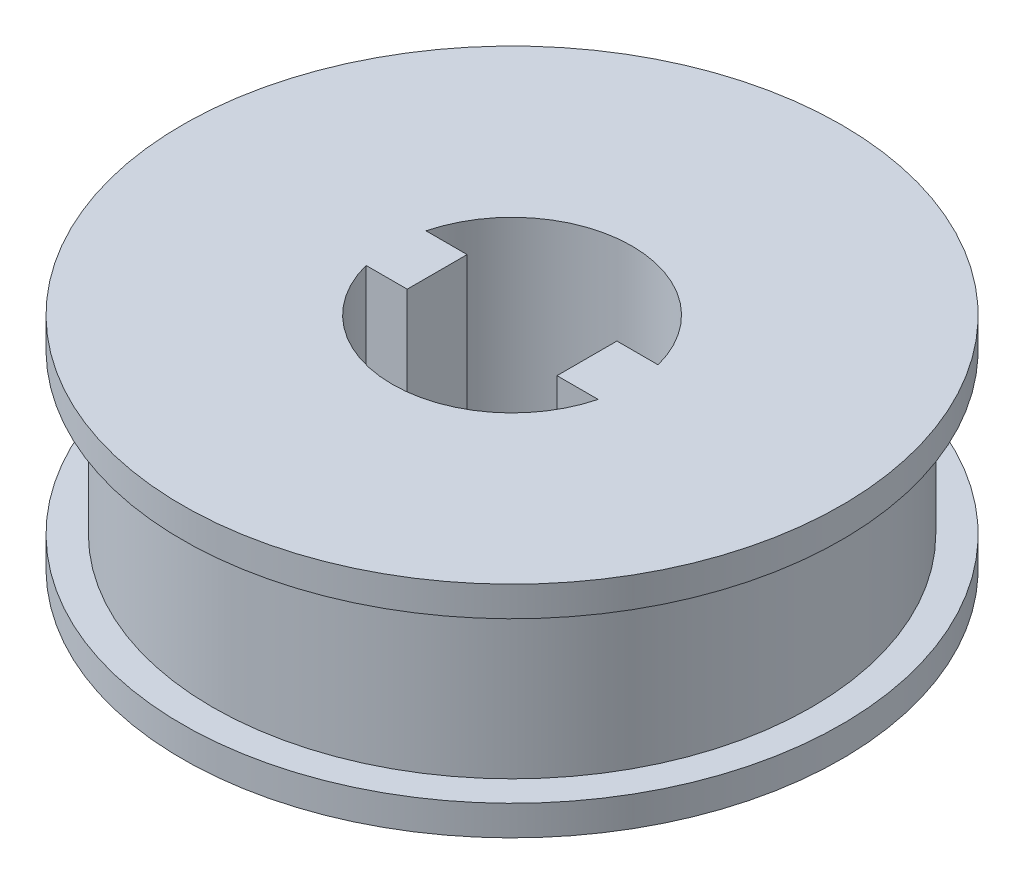
ISO-10303-21;
HEADER;
FILE_DESCRIPTION(('STEP AP214'),'2;1');
FILE_NAME('part.step','',(''),(''),'','','');
FILE_SCHEMA(('AUTOMOTIVE_DESIGN { 1 0 10303 214 1 1 1 1 }'));
ENDSEC;
DATA;
#1=APPLICATION_CONTEXT('core data for automotive mechanical design processes');
#2=APPLICATION_PROTOCOL_DEFINITION('international standard','automotive_design',2000,#1);
#3=PRODUCT_CONTEXT('',#1,'mechanical');
#4=PRODUCT('Part','Part','',(#3));
#5=PRODUCT_RELATED_PRODUCT_CATEGORY('part','',(#4));
#6=PRODUCT_DEFINITION_FORMATION('','',#4);
#7=PRODUCT_DEFINITION_CONTEXT('part definition',#1,'design');
#8=PRODUCT_DEFINITION('design','',#6,#7);
#9=PRODUCT_DEFINITION_SHAPE('','',#8);
#10=(LENGTH_UNIT() NAMED_UNIT(*) SI_UNIT(.MILLI.,.METRE.));
#11=(NAMED_UNIT(*) PLANE_ANGLE_UNIT() SI_UNIT($,.RADIAN.));
#12=(NAMED_UNIT(*) SI_UNIT($,.STERADIAN.) SOLID_ANGLE_UNIT());
#13=UNCERTAINTY_MEASURE_WITH_UNIT(LENGTH_MEASURE(1.E-05),#10,'distance_accuracy_value','');
#14=(GEOMETRIC_REPRESENTATION_CONTEXT(3) GLOBAL_UNCERTAINTY_ASSIGNED_CONTEXT((#13)) GLOBAL_UNIT_ASSIGNED_CONTEXT((#10,
#11,#12)) REPRESENTATION_CONTEXT('',''));
#15=CARTESIAN_POINT('',(0.,0.,0.));
#16=DIRECTION('',(0.,0.,1.));
#17=DIRECTION('',(1.,0.,0.));
#18=AXIS2_PLACEMENT_3D('',#15,#16,#17);
#19=CARTESIAN_POINT('',(0.,0.,0.));
#20=DIRECTION('',(0.,-1.,0.));
#21=DIRECTION('',(0.,0.,-1.));
#22=AXIS2_PLACEMENT_3D('',#19,#20,#21);
#23=CYLINDRICAL_SURFACE('',#22,6.);
#24=DIRECTION('',(0.,-1.,0.));
#25=VECTOR('',#24,1.);
#26=CARTESIAN_POINT('',(5.80947501931113,0.,1.5));
#27=LINE('',#26,#25);
#28=CARTESIAN_POINT('',(5.80947501931113,-5.63471383479227,1.5));
#29=VERTEX_POINT('',#28);
#30=CARTESIAN_POINT('',(5.80947501931113,5.36528616520775,1.5));
#31=VERTEX_POINT('',#30);
#32=EDGE_CURVE('E11',#29,#31,#27,.F.);
#33=ORIENTED_EDGE('',*,*,#32,.F.);
#34=CARTESIAN_POINT('',(0.,-5.6347138347923,0.));
#35=DIRECTION('',(0.,-1.,0.));
#36=DIRECTION('',(0.,0.,-1.));
#37=AXIS2_PLACEMENT_3D('',#34,#35,#36);
#38=CIRCLE('',#37,6.);
#39=CARTESIAN_POINT('',(-5.80947501931113,-5.63471383479227,1.5));
#40=VERTEX_POINT('',#39);
#41=EDGE_CURVE('E149',#29,#40,#38,.T.);
#42=ORIENTED_EDGE('',*,*,#41,.T.);
#43=DIRECTION('',(0.,-1.,0.));
#44=VECTOR('',#43,1.);
#45=CARTESIAN_POINT('',(-5.80947501931113,0.,1.5));
#46=LINE('',#45,#44);
#47=CARTESIAN_POINT('',(-5.80947501931113,5.36528616520772,1.5));
#48=VERTEX_POINT('',#47);
#49=EDGE_CURVE('E172',#48,#40,#46,.T.);
#50=ORIENTED_EDGE('',*,*,#49,.F.);
#51=CARTESIAN_POINT('',(0.,5.36528616520775,0.));
#52=DIRECTION('',(0.,-1.,0.));
#53=DIRECTION('',(0.,0.,-1.));
#54=AXIS2_PLACEMENT_3D('',#51,#52,#53);
#55=CIRCLE('',#54,6.);
#56=EDGE_CURVE('E145',#31,#48,#55,.T.);
#57=ORIENTED_EDGE('',*,*,#56,.F.);
#58=EDGE_LOOP('',(#33,#42,#50,#57));
#59=FACE_BOUND('',#58,.T.);
#60=ADVANCED_FACE('F32',(#59),#23,.F.);
#61=CARTESIAN_POINT('',(6.,5.36528616520772,0.));
#62=DIRECTION('',(0.,1.,0.));
#63=DIRECTION('',(0.,0.,1.));
#64=AXIS2_PLACEMENT_3D('',#61,#62,#63);
#65=PLANE('',#64);
#66=CARTESIAN_POINT('',(-5.80947501931113,5.36528616520775,-1.5));
#67=VERTEX_POINT('',#66);
#68=CARTESIAN_POINT('',(5.80947501931113,5.36528616520772,-1.5));
#69=VERTEX_POINT('',#68);
#70=EDGE_CURVE('E147',#67,#69,#55,.T.);
#71=ORIENTED_EDGE('',*,*,#70,.T.);
#72=DIRECTION('',(-1.,0.,0.));
#73=VECTOR('',#72,1.);
#74=CARTESIAN_POINT('',(8.25,5.36528616520772,-1.5));
#75=LINE('',#74,#73);
#76=CARTESIAN_POINT('',(3.75,5.36528616520772,-1.5));
#77=VERTEX_POINT('',#76);
#78=EDGE_CURVE('E125',#69,#77,#75,.T.);
#79=ORIENTED_EDGE('',*,*,#78,.T.);
#80=DIRECTION('',(0.,0.,1.));
#81=VECTOR('',#80,1.);
#82=CARTESIAN_POINT('',(3.75,5.36528616520772,1.5));
#83=LINE('',#82,#81);
#84=CARTESIAN_POINT('',(3.75,5.36528616520772,1.5));
#85=VERTEX_POINT('',#84);
#86=EDGE_CURVE('E114',#77,#85,#83,.T.);
#87=ORIENTED_EDGE('',*,*,#86,.T.);
#88=DIRECTION('',(1.,0.,0.));
#89=VECTOR('',#88,1.);
#90=CARTESIAN_POINT('',(8.25,5.36528616520772,1.5));
#91=LINE('',#90,#89);
#92=EDGE_CURVE('E47',#85,#31,#91,.T.);
#93=ORIENTED_EDGE('',*,*,#92,.T.);
#94=ORIENTED_EDGE('',*,*,#56,.T.);
#95=DIRECTION('',(1.,0.,0.));
#96=VECTOR('',#95,1.);
#97=CARTESIAN_POINT('',(-8.25,5.36528616520772,1.5));
#98=LINE('',#97,#96);
#99=CARTESIAN_POINT('',(-3.75,5.36528616520772,1.5));
#100=VERTEX_POINT('',#99);
#101=EDGE_CURVE('E134',#48,#100,#98,.T.);
#102=ORIENTED_EDGE('',*,*,#101,.T.);
#103=DIRECTION('',(0.,0.,-1.));
#104=VECTOR('',#103,1.);
#105=CARTESIAN_POINT('',(-3.75,5.36528616520772,1.5));
#106=LINE('',#105,#104);
#107=CARTESIAN_POINT('',(-3.75,5.36528616520772,-1.5));
#108=VERTEX_POINT('',#107);
#109=EDGE_CURVE('E128',#100,#108,#106,.T.);
#110=ORIENTED_EDGE('',*,*,#109,.T.);
#111=DIRECTION('',(-1.,0.,0.));
#112=VECTOR('',#111,1.);
#113=CARTESIAN_POINT('',(-8.25,5.36528616520772,-1.5));
#114=LINE('',#113,#112);
#115=EDGE_CURVE('E53',#108,#67,#114,.T.);
#116=ORIENTED_EDGE('',*,*,#115,.T.);
#117=EDGE_LOOP('',(#71,#79,#87,#93,#94,#102,#110,#116));
#118=FACE_BOUND('',#117,.T.);
#119=CARTESIAN_POINT('',(0.,5.3652861652077,0.));
#120=DIRECTION('',(0.,-1.,0.));
#121=DIRECTION('',(0.,0.,-1.));
#122=AXIS2_PLACEMENT_3D('',#119,#120,#121);
#123=CIRCLE('',#122,16.5);
#124=CARTESIAN_POINT('',(0.,5.3652861652077,-16.5));
#125=VERTEX_POINT('',#124);
#126=EDGE_CURVE('E167',#125,#125,#123,.T.);
#127=ORIENTED_EDGE('',*,*,#126,.F.);
#128=EDGE_LOOP('',(#127));
#129=FACE_BOUND('',#128,.T.);
#130=ADVANCED_FACE('F34',(#118,#129),#65,.T.);
#131=CARTESIAN_POINT('',(0.,0.,0.));
#132=DIRECTION('',(0.,-1.,0.));
#133=DIRECTION('',(0.,0.,-1.));
#134=AXIS2_PLACEMENT_3D('',#131,#132,#133);
#135=CYLINDRICAL_SURFACE('',#134,16.5);
#136=ORIENTED_EDGE('',*,*,#126,.T.);
#137=EDGE_LOOP('',(#136));
#138=FACE_BOUND('',#137,.T.);
#139=CARTESIAN_POINT('',(0.,3.8652861652077,0.));
#140=DIRECTION('',(0.,-1.,0.));
#141=DIRECTION('',(0.,0.,-1.));
#142=AXIS2_PLACEMENT_3D('',#139,#140,#141);
#143=CIRCLE('',#142,16.5);
#144=CARTESIAN_POINT('',(0.,3.8652861652077,-16.5));
#145=VERTEX_POINT('',#144);
#146=EDGE_CURVE('E164',#145,#145,#143,.T.);
#147=ORIENTED_EDGE('',*,*,#146,.F.);
#148=EDGE_LOOP('',(#147));
#149=FACE_BOUND('',#148,.T.);
#150=ADVANCED_FACE('F211',(#138,#149),#135,.T.);
#151=CARTESIAN_POINT('',(16.5,3.86528616520777,0.));
#152=DIRECTION('',(0.,-1.,0.));
#153=DIRECTION('',(0.,0.,-1.));
#154=AXIS2_PLACEMENT_3D('',#151,#152,#153);
#155=PLANE('',#154);
#156=ORIENTED_EDGE('',*,*,#146,.T.);
#157=EDGE_LOOP('',(#156));
#158=FACE_BOUND('',#157,.T.);
#159=CARTESIAN_POINT('',(0.,3.86528616520783,0.));
#160=DIRECTION('',(0.,-1.,0.));
#161=DIRECTION('',(0.,0.,-1.));
#162=AXIS2_PLACEMENT_3D('',#159,#160,#161);
#163=CIRCLE('',#162,15.);
#164=CARTESIAN_POINT('',(0.,3.86528616520783,-15.));
#165=VERTEX_POINT('',#164);
#166=EDGE_CURVE('E161',#165,#165,#163,.T.);
#167=ORIENTED_EDGE('',*,*,#166,.F.);
#168=EDGE_LOOP('',(#167));
#169=FACE_BOUND('',#168,.T.);
#170=ADVANCED_FACE('F232',(#158,#169),#155,.T.);
#171=CARTESIAN_POINT('',(0.,0.,0.));
#172=DIRECTION('',(0.,-1.,0.));
#173=DIRECTION('',(0.,0.,-1.));
#174=AXIS2_PLACEMENT_3D('',#171,#172,#173);
#175=CYLINDRICAL_SURFACE('',#174,15.);
#176=ORIENTED_EDGE('',*,*,#166,.T.);
#177=EDGE_LOOP('',(#176));
#178=FACE_BOUND('',#177,.T.);
#179=CARTESIAN_POINT('',(0.,-4.1347138347923,0.));
#180=DIRECTION('',(0.,-1.,0.));
#181=DIRECTION('',(0.,0.,-1.));
#182=AXIS2_PLACEMENT_3D('',#179,#180,#181);
#183=CIRCLE('',#182,15.);
#184=CARTESIAN_POINT('',(0.,-4.1347138347923,-15.));
#185=VERTEX_POINT('',#184);
#186=EDGE_CURVE('E158',#185,#185,#183,.T.);
#187=ORIENTED_EDGE('',*,*,#186,.F.);
#188=EDGE_LOOP('',(#187));
#189=FACE_BOUND('',#188,.T.);
#190=ADVANCED_FACE('F228',(#178,#189),#175,.T.);
#191=CARTESIAN_POINT('',(15.,-4.1347138347923,0.));
#192=DIRECTION('',(0.,1.,0.));
#193=DIRECTION('',(0.,0.,1.));
#194=AXIS2_PLACEMENT_3D('',#191,#192,#193);
#195=PLANE('',#194);
#196=ORIENTED_EDGE('',*,*,#186,.T.);
#197=EDGE_LOOP('',(#196));
#198=FACE_BOUND('',#197,.T.);
#199=CARTESIAN_POINT('',(0.,-4.1347138347923,0.));
#200=DIRECTION('',(0.,-1.,0.));
#201=DIRECTION('',(0.,0.,-1.));
#202=AXIS2_PLACEMENT_3D('',#199,#200,#201);
#203=CIRCLE('',#202,16.5);
#204=CARTESIAN_POINT('',(0.,-4.1347138347923,-16.5));
#205=VERTEX_POINT('',#204);
#206=EDGE_CURVE('E155',#205,#205,#203,.T.);
#207=ORIENTED_EDGE('',*,*,#206,.F.);
#208=EDGE_LOOP('',(#207));
#209=FACE_BOUND('',#208,.T.);
#210=ADVANCED_FACE('F222',(#198,#209),#195,.T.);
#211=CARTESIAN_POINT('',(0.,0.,0.));
#212=DIRECTION('',(0.,-1.,0.));
#213=DIRECTION('',(0.,0.,-1.));
#214=AXIS2_PLACEMENT_3D('',#211,#212,#213);
#215=CYLINDRICAL_SURFACE('',#214,16.5);
#216=ORIENTED_EDGE('',*,*,#206,.T.);
#217=EDGE_LOOP('',(#216));
#218=FACE_BOUND('',#217,.T.);
#219=CARTESIAN_POINT('',(0.,-5.6347138347923,0.));
#220=DIRECTION('',(0.,-1.,0.));
#221=DIRECTION('',(0.,0.,-1.));
#222=AXIS2_PLACEMENT_3D('',#219,#220,#221);
#223=CIRCLE('',#222,16.5);
#224=CARTESIAN_POINT('',(0.,-5.6347138347923,-16.5));
#225=VERTEX_POINT('',#224);
#226=EDGE_CURVE('E152',#225,#225,#223,.T.);
#227=ORIENTED_EDGE('',*,*,#226,.F.);
#228=EDGE_LOOP('',(#227));
#229=FACE_BOUND('',#228,.T.);
#230=ADVANCED_FACE('F218',(#218,#229),#215,.T.);
#231=CARTESIAN_POINT('',(16.5,-5.6347138347923,0.));
#232=DIRECTION('',(0.,-1.,0.));
#233=DIRECTION('',(0.,0.,-1.));
#234=AXIS2_PLACEMENT_3D('',#231,#232,#233);
#235=PLANE('',#234);
#236=ORIENTED_EDGE('',*,*,#41,.F.);
#237=DIRECTION('',(1.,0.,0.));
#238=VECTOR('',#237,1.);
#239=CARTESIAN_POINT('',(8.25,-5.63471383479227,1.5));
#240=LINE('',#239,#238);
#241=CARTESIAN_POINT('',(3.75,-5.63471383479227,1.5));
#242=VERTEX_POINT('',#241);
#243=EDGE_CURVE('E109',#242,#29,#240,.T.);
#244=ORIENTED_EDGE('',*,*,#243,.F.);
#245=DIRECTION('',(0.,0.,1.));
#246=VECTOR('',#245,1.);
#247=CARTESIAN_POINT('',(3.75,-5.63471383479227,1.5));
#248=LINE('',#247,#246);
#249=CARTESIAN_POINT('',(3.75,-5.63471383479227,-1.5));
#250=VERTEX_POINT('',#249);
#251=EDGE_CURVE('E108',#250,#242,#248,.T.);
#252=ORIENTED_EDGE('',*,*,#251,.F.);
#253=DIRECTION('',(-1.,0.,0.));
#254=VECTOR('',#253,1.);
#255=CARTESIAN_POINT('',(8.25,-5.63471383479227,-1.5));
#256=LINE('',#255,#254);
#257=CARTESIAN_POINT('',(5.80947501931113,-5.63471383479227,-1.5));
#258=VERTEX_POINT('',#257);
#259=EDGE_CURVE('E98',#258,#250,#256,.T.);
#260=ORIENTED_EDGE('',*,*,#259,.F.);
#261=CARTESIAN_POINT('',(-5.80947501931113,-5.63471383479227,-1.5));
#262=VERTEX_POINT('',#261);
#263=EDGE_CURVE('E150',#262,#258,#38,.T.);
#264=ORIENTED_EDGE('',*,*,#263,.F.);
#265=DIRECTION('',(-1.,0.,0.));
#266=VECTOR('',#265,1.);
#267=CARTESIAN_POINT('',(-8.25,-5.63471383479227,-1.5));
#268=LINE('',#267,#266);
#269=CARTESIAN_POINT('',(-3.75,-5.63471383479227,-1.5));
#270=VERTEX_POINT('',#269);
#271=EDGE_CURVE('E133',#270,#262,#268,.T.);
#272=ORIENTED_EDGE('',*,*,#271,.F.);
#273=DIRECTION('',(0.,0.,-1.));
#274=VECTOR('',#273,1.);
#275=CARTESIAN_POINT('',(-3.75,-5.63471383479227,1.5));
#276=LINE('',#275,#274);
#277=CARTESIAN_POINT('',(-3.75,-5.63471383479227,1.5));
#278=VERTEX_POINT('',#277);
#279=EDGE_CURVE('E130',#278,#270,#276,.T.);
#280=ORIENTED_EDGE('',*,*,#279,.F.);
#281=DIRECTION('',(1.,0.,0.));
#282=VECTOR('',#281,1.);
#283=CARTESIAN_POINT('',(-8.25,-5.63471383479227,1.5));
#284=LINE('',#283,#282);
#285=EDGE_CURVE('E136',#40,#278,#284,.T.);
#286=ORIENTED_EDGE('',*,*,#285,.F.);
#287=EDGE_LOOP('',(#236,#244,#252,#260,#264,#272,#280,#286));
#288=FACE_BOUND('',#287,.T.);
#289=ORIENTED_EDGE('',*,*,#226,.T.);
#290=EDGE_LOOP('',(#289));
#291=FACE_BOUND('',#290,.T.);
#292=ADVANCED_FACE('F119',(#288,#291),#235,.T.);
#293=DIRECTION('',(0.,-1.,0.));
#294=VECTOR('',#293,1.);
#295=CARTESIAN_POINT('',(5.80947501931113,0.,-1.5));
#296=LINE('',#295,#294);
#297=EDGE_CURVE('E40',#69,#258,#296,.T.);
#298=ORIENTED_EDGE('',*,*,#297,.F.);
#299=ORIENTED_EDGE('',*,*,#70,.F.);
#300=DIRECTION('',(0.,-1.,0.));
#301=VECTOR('',#300,1.);
#302=CARTESIAN_POINT('',(-5.80947501931113,0.,-1.5));
#303=LINE('',#302,#301);
#304=EDGE_CURVE('E170',#262,#67,#303,.F.);
#305=ORIENTED_EDGE('',*,*,#304,.F.);
#306=ORIENTED_EDGE('',*,*,#263,.T.);
#307=EDGE_LOOP('',(#298,#299,#305,#306));
#308=FACE_BOUND('',#307,.T.);
#309=ADVANCED_FACE('F193',(#308),#23,.F.);
#310=CARTESIAN_POINT('',(-3.75,-5.63471383479227,1.5));
#311=DIRECTION('',(1.,0.,0.));
#312=DIRECTION('',(0.,0.,-1.));
#313=AXIS2_PLACEMENT_3D('',#310,#311,#312);
#314=PLANE('',#313);
#315=ORIENTED_EDGE('',*,*,#109,.F.);
#316=DIRECTION('',(0.,1.,0.));
#317=VECTOR('',#316,1.);
#318=CARTESIAN_POINT('',(-3.75,-5.63471383479227,1.5));
#319=LINE('',#318,#317);
#320=EDGE_CURVE('E142',#278,#100,#319,.T.);
#321=ORIENTED_EDGE('',*,*,#320,.F.);
#322=ORIENTED_EDGE('',*,*,#279,.T.);
#323=DIRECTION('',(0.,1.,0.));
#324=VECTOR('',#323,1.);
#325=CARTESIAN_POINT('',(-3.75,-5.63471383479227,-1.5));
#326=LINE('',#325,#324);
#327=EDGE_CURVE('E138',#270,#108,#326,.T.);
#328=ORIENTED_EDGE('',*,*,#327,.T.);
#329=EDGE_LOOP('',(#315,#321,#322,#328));
#330=FACE_BOUND('',#329,.T.);
#331=ADVANCED_FACE('F186',(#330),#314,.T.);
#332=CARTESIAN_POINT('',(-8.25,-5.63471383479227,1.5));
#333=DIRECTION('',(0.,0.,1.));
#334=DIRECTION('',(1.,0.,0.));
#335=AXIS2_PLACEMENT_3D('',#332,#333,#334);
#336=PLANE('',#335);
#337=ORIENTED_EDGE('',*,*,#101,.F.);
#338=ORIENTED_EDGE('',*,*,#49,.T.);
#339=ORIENTED_EDGE('',*,*,#285,.T.);
#340=ORIENTED_EDGE('',*,*,#320,.T.);
#341=EDGE_LOOP('',(#337,#338,#339,#340));
#342=FACE_BOUND('',#341,.T.);
#343=ADVANCED_FACE('F178',(#342),#336,.T.);
#344=CARTESIAN_POINT('',(-8.25,-5.63471383479227,-1.5));
#345=DIRECTION('',(0.,0.,-1.));
#346=DIRECTION('',(-1.,0.,0.));
#347=AXIS2_PLACEMENT_3D('',#344,#345,#346);
#348=PLANE('',#347);
#349=ORIENTED_EDGE('',*,*,#271,.T.);
#350=ORIENTED_EDGE('',*,*,#304,.T.);
#351=ORIENTED_EDGE('',*,*,#115,.F.);
#352=ORIENTED_EDGE('',*,*,#327,.F.);
#353=EDGE_LOOP('',(#349,#350,#351,#352));
#354=FACE_BOUND('',#353,.T.);
#355=ADVANCED_FACE('F196',(#354),#348,.T.);
#356=CARTESIAN_POINT('',(8.25,-5.63471383479227,1.5));
#357=DIRECTION('',(0.,0.,1.));
#358=DIRECTION('',(1.,0.,0.));
#359=AXIS2_PLACEMENT_3D('',#356,#357,#358);
#360=PLANE('',#359);
#361=ORIENTED_EDGE('',*,*,#243,.T.);
#362=ORIENTED_EDGE('',*,*,#32,.T.);
#363=ORIENTED_EDGE('',*,*,#92,.F.);
#364=DIRECTION('',(0.,1.,0.));
#365=VECTOR('',#364,1.);
#366=CARTESIAN_POINT('',(3.75,-5.63471383479227,1.5));
#367=LINE('',#366,#365);
#368=EDGE_CURVE('E115',#242,#85,#367,.T.);
#369=ORIENTED_EDGE('',*,*,#368,.F.);
#370=EDGE_LOOP('',(#361,#362,#363,#369));
#371=FACE_BOUND('',#370,.T.);
#372=ADVANCED_FACE('F190',(#371),#360,.T.);
#373=CARTESIAN_POINT('',(3.75,-5.63471383479227,1.5));
#374=DIRECTION('',(-1.,0.,0.));
#375=DIRECTION('',(0.,0.,1.));
#376=AXIS2_PLACEMENT_3D('',#373,#374,#375);
#377=PLANE('',#376);
#378=ORIENTED_EDGE('',*,*,#86,.F.);
#379=DIRECTION('',(0.,1.,0.));
#380=VECTOR('',#379,1.);
#381=CARTESIAN_POINT('',(3.75,-5.63471383479227,-1.5));
#382=LINE('',#381,#380);
#383=EDGE_CURVE('E101',#250,#77,#382,.T.);
#384=ORIENTED_EDGE('',*,*,#383,.F.);
#385=ORIENTED_EDGE('',*,*,#251,.T.);
#386=ORIENTED_EDGE('',*,*,#368,.T.);
#387=EDGE_LOOP('',(#378,#384,#385,#386));
#388=FACE_BOUND('',#387,.T.);
#389=ADVANCED_FACE('F113',(#388),#377,.T.);
#390=CARTESIAN_POINT('',(8.25,-5.63471383479227,-1.5));
#391=DIRECTION('',(0.,0.,-1.));
#392=DIRECTION('',(-1.,0.,0.));
#393=AXIS2_PLACEMENT_3D('',#390,#391,#392);
#394=PLANE('',#393);
#395=ORIENTED_EDGE('',*,*,#78,.F.);
#396=ORIENTED_EDGE('',*,*,#297,.T.);
#397=ORIENTED_EDGE('',*,*,#259,.T.);
#398=ORIENTED_EDGE('',*,*,#383,.T.);
#399=EDGE_LOOP('',(#395,#396,#397,#398));
#400=FACE_BOUND('',#399,.T.);
#401=ADVANCED_FACE('F100',(#400),#394,.T.);
#402=CLOSED_SHELL('',(#60,#130,#150,#170,#190,#210,#230,#292,#309,#331,#343,#355,#372,#389,#401));
#403=MANIFOLD_SOLID_BREP('B2',#402);
#404=ADVANCED_BREP_SHAPE_REPRESENTATION('',(#18,#403),#14);
#405=SHAPE_DEFINITION_REPRESENTATION(#9,#404);
ENDSEC;
END-ISO-10303-21;
